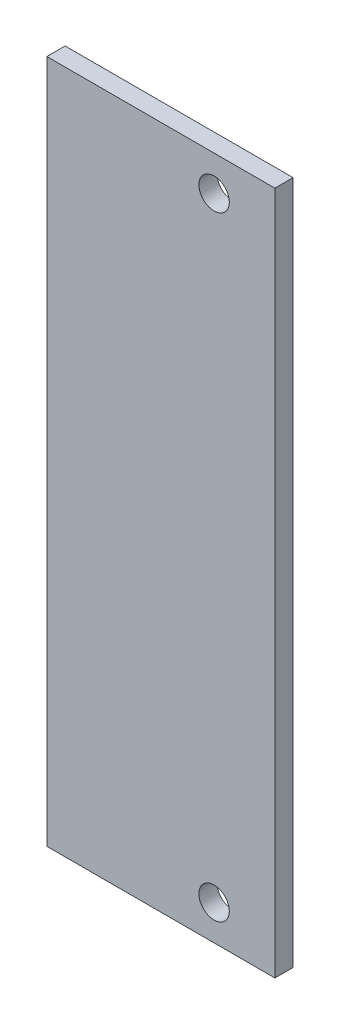
ISO-10303-21;
HEADER;
FILE_DESCRIPTION(('STEP AP214'),'2;1');
FILE_NAME('part.step','',(''),(''),'','','');
FILE_SCHEMA(('AUTOMOTIVE_DESIGN { 1 0 10303 214 1 1 1 1 }'));
ENDSEC;
DATA;
#1=APPLICATION_CONTEXT('core data for automotive mechanical design processes');
#2=APPLICATION_PROTOCOL_DEFINITION('international standard','automotive_design',2000,#1);
#3=PRODUCT_CONTEXT('',#1,'mechanical');
#4=PRODUCT('Part','Part','',(#3));
#5=PRODUCT_RELATED_PRODUCT_CATEGORY('part','',(#4));
#6=PRODUCT_DEFINITION_FORMATION('','',#4);
#7=PRODUCT_DEFINITION_CONTEXT('part definition',#1,'design');
#8=PRODUCT_DEFINITION('design','',#6,#7);
#9=PRODUCT_DEFINITION_SHAPE('','',#8);
#10=(LENGTH_UNIT() NAMED_UNIT(*) SI_UNIT(.MILLI.,.METRE.));
#11=(NAMED_UNIT(*) PLANE_ANGLE_UNIT() SI_UNIT($,.RADIAN.));
#12=(NAMED_UNIT(*) SI_UNIT($,.STERADIAN.) SOLID_ANGLE_UNIT());
#13=UNCERTAINTY_MEASURE_WITH_UNIT(LENGTH_MEASURE(1.E-05),#10,'distance_accuracy_value','');
#14=(GEOMETRIC_REPRESENTATION_CONTEXT(3) GLOBAL_UNCERTAINTY_ASSIGNED_CONTEXT((#13)) GLOBAL_UNIT_ASSIGNED_CONTEXT((#10,
#11,#12)) REPRESENTATION_CONTEXT('',''));
#15=CARTESIAN_POINT('',(0.,0.,0.));
#16=DIRECTION('',(0.,0.,1.));
#17=DIRECTION('',(1.,0.,0.));
#18=AXIS2_PLACEMENT_3D('',#15,#16,#17);
#19=CARTESIAN_POINT('',(0.,0.,-1.2));
#20=DIRECTION('',(0.,-1.,0.));
#21=DIRECTION('',(0.,0.,-1.));
#22=AXIS2_PLACEMENT_3D('',#19,#20,#21);
#23=PLANE('',#22);
#24=DIRECTION('',(1.,0.,0.));
#25=VECTOR('',#24,1.);
#26=CARTESIAN_POINT('',(0.,0.,0.));
#27=LINE('',#26,#25);
#28=CARTESIAN_POINT('',(-15.,0.,0.));
#29=VERTEX_POINT('',#28);
#30=CARTESIAN_POINT('',(0.,0.,0.));
#31=VERTEX_POINT('',#30);
#32=EDGE_CURVE('E118',#29,#31,#27,.T.);
#33=ORIENTED_EDGE('',*,*,#32,.F.);
#34=DIRECTION('',(0.,0.,1.));
#35=VECTOR('',#34,1.);
#36=CARTESIAN_POINT('',(-15.,0.,0.));
#37=LINE('',#36,#35);
#38=CARTESIAN_POINT('',(-15.,0.,-1.2));
#39=VERTEX_POINT('',#38);
#40=EDGE_CURVE('E105',#39,#29,#37,.T.);
#41=ORIENTED_EDGE('',*,*,#40,.F.);
#42=DIRECTION('',(1.,0.,0.));
#43=VECTOR('',#42,1.);
#44=CARTESIAN_POINT('',(0.,0.,-1.2));
#45=LINE('',#44,#43);
#46=CARTESIAN_POINT('',(0.,0.,-1.2));
#47=VERTEX_POINT('',#46);
#48=EDGE_CURVE('E98',#39,#47,#45,.T.);
#49=ORIENTED_EDGE('',*,*,#48,.T.);
#50=DIRECTION('',(0.,0.,1.));
#51=VECTOR('',#50,1.);
#52=CARTESIAN_POINT('',(0.,0.,-1.2));
#53=LINE('',#52,#51);
#54=EDGE_CURVE('E48',#47,#31,#53,.T.);
#55=ORIENTED_EDGE('',*,*,#54,.T.);
#56=EDGE_LOOP('',(#33,#41,#49,#55));
#57=FACE_BOUND('',#56,.T.);
#58=ADVANCED_FACE('F44',(#57),#23,.T.);
#59=CARTESIAN_POINT('',(0.,45.,-1.2));
#60=DIRECTION('',(0.,1.,0.));
#61=DIRECTION('',(0.,0.,1.));
#62=AXIS2_PLACEMENT_3D('',#59,#60,#61);
#63=PLANE('',#62);
#64=DIRECTION('',(-1.,0.,0.));
#65=VECTOR('',#64,1.);
#66=CARTESIAN_POINT('',(0.,45.,0.));
#67=LINE('',#66,#65);
#68=CARTESIAN_POINT('',(0.,45.,0.));
#69=VERTEX_POINT('',#68);
#70=CARTESIAN_POINT('',(-15.,45.,0.));
#71=VERTEX_POINT('',#70);
#72=EDGE_CURVE('E77',#69,#71,#67,.T.);
#73=ORIENTED_EDGE('',*,*,#72,.F.);
#74=DIRECTION('',(0.,0.,1.));
#75=VECTOR('',#74,1.);
#76=CARTESIAN_POINT('',(0.,45.,-1.2));
#77=LINE('',#76,#75);
#78=CARTESIAN_POINT('',(0.,45.,-1.2));
#79=VERTEX_POINT('',#78);
#80=EDGE_CURVE('E11',#79,#69,#77,.T.);
#81=ORIENTED_EDGE('',*,*,#80,.F.);
#82=DIRECTION('',(-1.,0.,0.));
#83=VECTOR('',#82,1.);
#84=CARTESIAN_POINT('',(0.,45.,-1.2));
#85=LINE('',#84,#83);
#86=CARTESIAN_POINT('',(-15.,45.,-1.2));
#87=VERTEX_POINT('',#86);
#88=EDGE_CURVE('E84',#79,#87,#85,.T.);
#89=ORIENTED_EDGE('',*,*,#88,.T.);
#90=DIRECTION('',(0.,0.,-1.));
#91=VECTOR('',#90,1.);
#92=CARTESIAN_POINT('',(-15.,45.,0.));
#93=LINE('',#92,#91);
#94=EDGE_CURVE('E90',#71,#87,#93,.T.);
#95=ORIENTED_EDGE('',*,*,#94,.F.);
#96=EDGE_LOOP('',(#73,#81,#89,#95));
#97=FACE_BOUND('',#96,.T.);
#98=ADVANCED_FACE('F87',(#97),#63,.T.);
#99=CARTESIAN_POINT('',(0.,0.,-1.2));
#100=DIRECTION('',(1.,0.,0.));
#101=DIRECTION('',(0.,0.,-1.));
#102=AXIS2_PLACEMENT_3D('',#99,#100,#101);
#103=PLANE('',#102);
#104=DIRECTION('',(0.,1.,0.));
#105=VECTOR('',#104,1.);
#106=CARTESIAN_POINT('',(0.,0.,0.));
#107=LINE('',#106,#105);
#108=EDGE_CURVE('E130',#31,#69,#107,.T.);
#109=ORIENTED_EDGE('',*,*,#108,.F.);
#110=ORIENTED_EDGE('',*,*,#54,.F.);
#111=DIRECTION('',(0.,1.,0.));
#112=VECTOR('',#111,1.);
#113=CARTESIAN_POINT('',(0.,0.,-1.2));
#114=LINE('',#113,#112);
#115=EDGE_CURVE('E91',#47,#79,#114,.T.);
#116=ORIENTED_EDGE('',*,*,#115,.T.);
#117=ORIENTED_EDGE('',*,*,#80,.T.);
#118=EDGE_LOOP('',(#109,#110,#116,#117));
#119=FACE_BOUND('',#118,.T.);
#120=ADVANCED_FACE('F132',(#119),#103,.T.);
#121=CARTESIAN_POINT('',(0.,0.,-1.2));
#122=DIRECTION('',(0.,0.,-1.));
#123=DIRECTION('',(-1.,0.,0.));
#124=AXIS2_PLACEMENT_3D('',#121,#122,#123);
#125=PLANE('',#124);
#126=CARTESIAN_POINT('',(-4.,42.7,-1.2));
#127=DIRECTION('',(0.,0.,1.));
#128=DIRECTION('',(-1.,0.,0.));
#129=AXIS2_PLACEMENT_3D('',#126,#127,#128);
#130=CIRCLE('',#129,0.999999999999991);
#131=CARTESIAN_POINT('',(-4.99999999999999,42.7,-1.2));
#132=VERTEX_POINT('',#131);
#133=EDGE_CURVE('E112',#132,#132,#130,.T.);
#134=ORIENTED_EDGE('',*,*,#133,.T.);
#135=EDGE_LOOP('',(#134));
#136=FACE_BOUND('',#135,.T.);
#137=CARTESIAN_POINT('',(-4.,2.3,-1.2));
#138=DIRECTION('',(0.,0.,1.));
#139=DIRECTION('',(1.,0.,0.));
#140=AXIS2_PLACEMENT_3D('',#137,#138,#139);
#141=CIRCLE('',#140,1.);
#142=CARTESIAN_POINT('',(-3.,2.3,-1.2));
#143=VERTEX_POINT('',#142);
#144=EDGE_CURVE('E120',#143,#143,#141,.T.);
#145=ORIENTED_EDGE('',*,*,#144,.T.);
#146=EDGE_LOOP('',(#145));
#147=FACE_BOUND('',#146,.T.);
#148=ORIENTED_EDGE('',*,*,#48,.F.);
#149=DIRECTION('',(0.,-1.,0.));
#150=VECTOR('',#149,1.);
#151=CARTESIAN_POINT('',(-15.,45.,-1.2));
#152=LINE('',#151,#150);
#153=EDGE_CURVE('E96',#87,#39,#152,.T.);
#154=ORIENTED_EDGE('',*,*,#153,.F.);
#155=ORIENTED_EDGE('',*,*,#88,.F.);
#156=ORIENTED_EDGE('',*,*,#115,.F.);
#157=EDGE_LOOP('',(#148,#154,#155,#156));
#158=FACE_BOUND('',#157,.T.);
#159=ADVANCED_FACE('F100',(#136,#147,#158),#125,.T.);
#160=CARTESIAN_POINT('',(0.,0.,0.));
#161=DIRECTION('',(0.,0.,-1.));
#162=DIRECTION('',(-1.,0.,0.));
#163=AXIS2_PLACEMENT_3D('',#160,#161,#162);
#164=PLANE('',#163);
#165=CARTESIAN_POINT('',(-4.,42.7,0.));
#166=DIRECTION('',(0.,0.,1.));
#167=DIRECTION('',(-1.,0.,0.));
#168=AXIS2_PLACEMENT_3D('',#165,#166,#167);
#169=CIRCLE('',#168,0.999999999999991);
#170=CARTESIAN_POINT('',(-4.99999999999999,42.7,0.));
#171=VERTEX_POINT('',#170);
#172=EDGE_CURVE('E109',#171,#171,#169,.T.);
#173=ORIENTED_EDGE('',*,*,#172,.F.);
#174=EDGE_LOOP('',(#173));
#175=FACE_BOUND('',#174,.T.);
#176=CARTESIAN_POINT('',(-4.,2.3,0.));
#177=DIRECTION('',(0.,0.,1.));
#178=DIRECTION('',(1.,0.,0.));
#179=AXIS2_PLACEMENT_3D('',#176,#177,#178);
#180=CIRCLE('',#179,1.);
#181=CARTESIAN_POINT('',(-3.,2.3,0.));
#182=VERTEX_POINT('',#181);
#183=EDGE_CURVE('E111',#182,#182,#180,.T.);
#184=ORIENTED_EDGE('',*,*,#183,.F.);
#185=EDGE_LOOP('',(#184));
#186=FACE_BOUND('',#185,.T.);
#187=ORIENTED_EDGE('',*,*,#32,.T.);
#188=ORIENTED_EDGE('',*,*,#108,.T.);
#189=ORIENTED_EDGE('',*,*,#72,.T.);
#190=DIRECTION('',(0.,1.,0.));
#191=VECTOR('',#190,1.);
#192=CARTESIAN_POINT('',(-15.,45.,0.));
#193=LINE('',#192,#191);
#194=EDGE_CURVE('E104',#29,#71,#193,.T.);
#195=ORIENTED_EDGE('',*,*,#194,.F.);
#196=EDGE_LOOP('',(#187,#188,#189,#195));
#197=FACE_BOUND('',#196,.T.);
#198=ADVANCED_FACE('F129',(#175,#186,#197),#164,.F.);
#199=CARTESIAN_POINT('',(-4.,2.3,-1.2));
#200=DIRECTION('',(0.,0.,1.));
#201=DIRECTION('',(1.,0.,0.));
#202=AXIS2_PLACEMENT_3D('',#199,#200,#201);
#203=CYLINDRICAL_SURFACE('',#202,1.);
#204=ORIENTED_EDGE('',*,*,#144,.F.);
#205=EDGE_LOOP('',(#204));
#206=FACE_BOUND('',#205,.T.);
#207=ORIENTED_EDGE('',*,*,#183,.T.);
#208=EDGE_LOOP('',(#207));
#209=FACE_BOUND('',#208,.T.);
#210=ADVANCED_FACE('F144',(#206,#209),#203,.F.);
#211=CARTESIAN_POINT('',(-4.,42.7,-1.2));
#212=DIRECTION('',(0.,0.,1.));
#213=DIRECTION('',(1.,0.,0.));
#214=AXIS2_PLACEMENT_3D('',#211,#212,#213);
#215=CYLINDRICAL_SURFACE('',#214,0.999999999999991);
#216=ORIENTED_EDGE('',*,*,#133,.F.);
#217=EDGE_LOOP('',(#216));
#218=FACE_BOUND('',#217,.T.);
#219=ORIENTED_EDGE('',*,*,#172,.T.);
#220=EDGE_LOOP('',(#219));
#221=FACE_BOUND('',#220,.T.);
#222=ADVANCED_FACE('F151',(#218,#221),#215,.F.);
#223=CARTESIAN_POINT('',(-15.,0.,0.));
#224=DIRECTION('',(-1.,0.,0.));
#225=DIRECTION('',(0.,0.,1.));
#226=AXIS2_PLACEMENT_3D('',#223,#224,#225);
#227=PLANE('',#226);
#228=ORIENTED_EDGE('',*,*,#94,.T.);
#229=ORIENTED_EDGE('',*,*,#153,.T.);
#230=ORIENTED_EDGE('',*,*,#40,.T.);
#231=ORIENTED_EDGE('',*,*,#194,.T.);
#232=EDGE_LOOP('',(#228,#229,#230,#231));
#233=FACE_BOUND('',#232,.T.);
#234=ADVANCED_FACE('F102',(#233),#227,.T.);
#235=CLOSED_SHELL('',(#58,#98,#120,#159,#198,#210,#222,#234));
#236=MANIFOLD_SOLID_BREP('B2',#235);
#237=ADVANCED_BREP_SHAPE_REPRESENTATION('',(#18,#236),#14);
#238=SHAPE_DEFINITION_REPRESENTATION(#9,#237);
ENDSEC;
END-ISO-10303-21;
